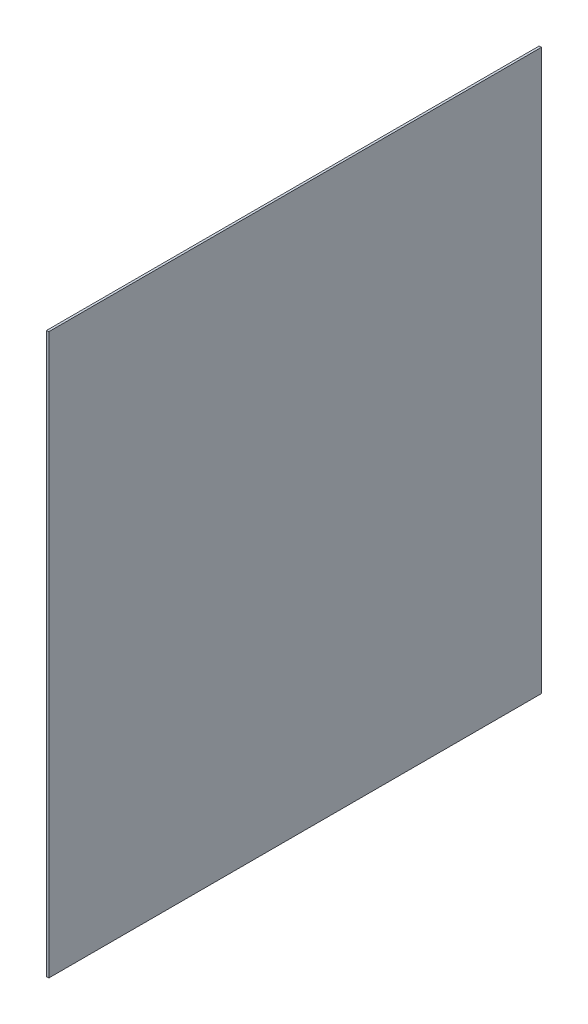
ISO-10303-21;
HEADER;
FILE_DESCRIPTION(('STEP AP214'),'2;1');
FILE_NAME('part.step','',(''),(''),'','','');
FILE_SCHEMA(('AUTOMOTIVE_DESIGN { 1 0 10303 214 1 1 1 1 }'));
ENDSEC;
DATA;
#1=APPLICATION_CONTEXT('core data for automotive mechanical design processes');
#2=APPLICATION_PROTOCOL_DEFINITION('international standard','automotive_design',2000,#1);
#3=PRODUCT_CONTEXT('',#1,'mechanical');
#4=PRODUCT('Part','Part','',(#3));
#5=PRODUCT_RELATED_PRODUCT_CATEGORY('part','',(#4));
#6=PRODUCT_DEFINITION_FORMATION('','',#4);
#7=PRODUCT_DEFINITION_CONTEXT('part definition',#1,'design');
#8=PRODUCT_DEFINITION('design','',#6,#7);
#9=PRODUCT_DEFINITION_SHAPE('','',#8);
#10=(LENGTH_UNIT() NAMED_UNIT(*) SI_UNIT(.MILLI.,.METRE.));
#11=(NAMED_UNIT(*) PLANE_ANGLE_UNIT() SI_UNIT($,.RADIAN.));
#12=(NAMED_UNIT(*) SI_UNIT($,.STERADIAN.) SOLID_ANGLE_UNIT());
#13=UNCERTAINTY_MEASURE_WITH_UNIT(LENGTH_MEASURE(1.E-05),#10,'distance_accuracy_value','');
#14=(GEOMETRIC_REPRESENTATION_CONTEXT(3) GLOBAL_UNCERTAINTY_ASSIGNED_CONTEXT((#13)) GLOBAL_UNIT_ASSIGNED_CONTEXT((#10,
#11,#12)) REPRESENTATION_CONTEXT('',''));
#15=CARTESIAN_POINT('',(0.,0.,0.));
#16=DIRECTION('',(0.,0.,1.));
#17=DIRECTION('',(1.,0.,0.));
#18=AXIS2_PLACEMENT_3D('',#15,#16,#17);
#19=CARTESIAN_POINT('',(2.,0.,440.));
#20=DIRECTION('',(-1.,0.,0.));
#21=DIRECTION('',(0.,0.,1.));
#22=AXIS2_PLACEMENT_3D('',#19,#20,#21);
#23=PLANE('',#22);
#24=DIRECTION('',(0.,1.,0.));
#25=VECTOR('',#24,1.);
#26=CARTESIAN_POINT('',(2.,0.,0.));
#27=LINE('',#26,#25);
#28=CARTESIAN_POINT('',(2.,0.,0.));
#29=VERTEX_POINT('',#28);
#30=CARTESIAN_POINT('',(2.,500.,0.));
#31=VERTEX_POINT('',#30);
#32=EDGE_CURVE('E100',#29,#31,#27,.T.);
#33=ORIENTED_EDGE('',*,*,#32,.T.);
#34=DIRECTION('',(0.,0.,-1.));
#35=VECTOR('',#34,1.);
#36=CARTESIAN_POINT('',(2.,500.,440.));
#37=LINE('',#36,#35);
#38=CARTESIAN_POINT('',(2.,500.,440.));
#39=VERTEX_POINT('',#38);
#40=EDGE_CURVE('E11',#39,#31,#37,.T.);
#41=ORIENTED_EDGE('',*,*,#40,.F.);
#42=DIRECTION('',(0.,1.,0.));
#43=VECTOR('',#42,1.);
#44=CARTESIAN_POINT('',(2.,0.,440.));
#45=LINE('',#44,#43);
#46=CARTESIAN_POINT('',(2.,0.,440.));
#47=VERTEX_POINT('',#46);
#48=EDGE_CURVE('E77',#47,#39,#45,.T.);
#49=ORIENTED_EDGE('',*,*,#48,.F.);
#50=DIRECTION('',(0.,0.,-1.));
#51=VECTOR('',#50,1.);
#52=CARTESIAN_POINT('',(2.,0.,440.));
#53=LINE('',#52,#51);
#54=EDGE_CURVE('E53',#47,#29,#53,.T.);
#55=ORIENTED_EDGE('',*,*,#54,.T.);
#56=EDGE_LOOP('',(#33,#41,#49,#55));
#57=FACE_BOUND('',#56,.T.);
#58=ADVANCED_FACE('F37',(#57),#23,.F.);
#59=CARTESIAN_POINT('',(0.,500.,440.));
#60=DIRECTION('',(0.,1.,0.));
#61=DIRECTION('',(0.,0.,1.));
#62=AXIS2_PLACEMENT_3D('',#59,#60,#61);
#63=PLANE('',#62);
#64=DIRECTION('',(1.,0.,0.));
#65=VECTOR('',#64,1.);
#66=CARTESIAN_POINT('',(0.,500.,0.));
#67=LINE('',#66,#65);
#68=CARTESIAN_POINT('',(0.,500.,0.));
#69=VERTEX_POINT('',#68);
#70=EDGE_CURVE('E86',#69,#31,#67,.T.);
#71=ORIENTED_EDGE('',*,*,#70,.F.);
#72=DIRECTION('',(0.,0.,-1.));
#73=VECTOR('',#72,1.);
#74=CARTESIAN_POINT('',(0.,500.,440.));
#75=LINE('',#74,#73);
#76=CARTESIAN_POINT('',(0.,500.,440.));
#77=VERTEX_POINT('',#76);
#78=EDGE_CURVE('E45',#77,#69,#75,.T.);
#79=ORIENTED_EDGE('',*,*,#78,.F.);
#80=DIRECTION('',(1.,0.,0.));
#81=VECTOR('',#80,1.);
#82=CARTESIAN_POINT('',(0.,500.,440.));
#83=LINE('',#82,#81);
#84=EDGE_CURVE('E84',#77,#39,#83,.T.);
#85=ORIENTED_EDGE('',*,*,#84,.T.);
#86=ORIENTED_EDGE('',*,*,#40,.T.);
#87=EDGE_LOOP('',(#71,#79,#85,#86));
#88=FACE_BOUND('',#87,.T.);
#89=ADVANCED_FACE('F83',(#88),#63,.T.);
#90=CARTESIAN_POINT('',(0.,0.,440.));
#91=DIRECTION('',(-1.,0.,0.));
#92=DIRECTION('',(0.,0.,1.));
#93=AXIS2_PLACEMENT_3D('',#90,#91,#92);
#94=PLANE('',#93);
#95=DIRECTION('',(0.,1.,0.));
#96=VECTOR('',#95,1.);
#97=CARTESIAN_POINT('',(0.,0.,0.));
#98=LINE('',#97,#96);
#99=CARTESIAN_POINT('',(0.,0.,0.));
#100=VERTEX_POINT('',#99);
#101=EDGE_CURVE('E103',#100,#69,#98,.T.);
#102=ORIENTED_EDGE('',*,*,#101,.F.);
#103=DIRECTION('',(0.,0.,-1.));
#104=VECTOR('',#103,1.);
#105=CARTESIAN_POINT('',(0.,0.,440.));
#106=LINE('',#105,#104);
#107=CARTESIAN_POINT('',(0.,0.,440.));
#108=VERTEX_POINT('',#107);
#109=EDGE_CURVE('E66',#108,#100,#106,.T.);
#110=ORIENTED_EDGE('',*,*,#109,.F.);
#111=DIRECTION('',(0.,1.,0.));
#112=VECTOR('',#111,1.);
#113=CARTESIAN_POINT('',(0.,0.,440.));
#114=LINE('',#113,#112);
#115=EDGE_CURVE('E92',#108,#77,#114,.T.);
#116=ORIENTED_EDGE('',*,*,#115,.T.);
#117=ORIENTED_EDGE('',*,*,#78,.T.);
#118=EDGE_LOOP('',(#102,#110,#116,#117));
#119=FACE_BOUND('',#118,.T.);
#120=ADVANCED_FACE('F94',(#119),#94,.T.);
#121=CARTESIAN_POINT('',(2.,0.,440.));
#122=DIRECTION('',(0.,-1.,0.));
#123=DIRECTION('',(0.,0.,-1.));
#124=AXIS2_PLACEMENT_3D('',#121,#122,#123);
#125=PLANE('',#124);
#126=DIRECTION('',(-1.,0.,0.));
#127=VECTOR('',#126,1.);
#128=CARTESIAN_POINT('',(2.,0.,0.));
#129=LINE('',#128,#127);
#130=EDGE_CURVE('E105',#29,#100,#129,.T.);
#131=ORIENTED_EDGE('',*,*,#130,.F.);
#132=ORIENTED_EDGE('',*,*,#54,.F.);
#133=DIRECTION('',(-1.,0.,0.));
#134=VECTOR('',#133,1.);
#135=CARTESIAN_POINT('',(2.,0.,440.));
#136=LINE('',#135,#134);
#137=EDGE_CURVE('E95',#47,#108,#136,.T.);
#138=ORIENTED_EDGE('',*,*,#137,.T.);
#139=ORIENTED_EDGE('',*,*,#109,.T.);
#140=EDGE_LOOP('',(#131,#132,#138,#139));
#141=FACE_BOUND('',#140,.T.);
#142=ADVANCED_FACE('F111',(#141),#125,.T.);
#143=CARTESIAN_POINT('',(2.,500.,440.));
#144=DIRECTION('',(0.,0.,-1.));
#145=DIRECTION('',(-1.,0.,0.));
#146=AXIS2_PLACEMENT_3D('',#143,#144,#145);
#147=PLANE('',#146);
#148=ORIENTED_EDGE('',*,*,#48,.T.);
#149=ORIENTED_EDGE('',*,*,#84,.F.);
#150=ORIENTED_EDGE('',*,*,#115,.F.);
#151=ORIENTED_EDGE('',*,*,#137,.F.);
#152=EDGE_LOOP('',(#148,#149,#150,#151));
#153=FACE_BOUND('',#152,.T.);
#154=ADVANCED_FACE('F91',(#153),#147,.F.);
#155=CARTESIAN_POINT('',(2.,500.,0.));
#156=DIRECTION('',(0.,0.,-1.));
#157=DIRECTION('',(-1.,0.,0.));
#158=AXIS2_PLACEMENT_3D('',#155,#156,#157);
#159=PLANE('',#158);
#160=ORIENTED_EDGE('',*,*,#32,.F.);
#161=ORIENTED_EDGE('',*,*,#130,.T.);
#162=ORIENTED_EDGE('',*,*,#101,.T.);
#163=ORIENTED_EDGE('',*,*,#70,.T.);
#164=EDGE_LOOP('',(#160,#161,#162,#163));
#165=FACE_BOUND('',#164,.T.);
#166=ADVANCED_FACE('F110',(#165),#159,.T.);
#167=CLOSED_SHELL('',(#58,#89,#120,#142,#154,#166));
#168=MANIFOLD_SOLID_BREP('B2',#167);
#169=ADVANCED_BREP_SHAPE_REPRESENTATION('',(#18,#168),#14);
#170=SHAPE_DEFINITION_REPRESENTATION(#9,#169);
ENDSEC;
END-ISO-10303-21;
